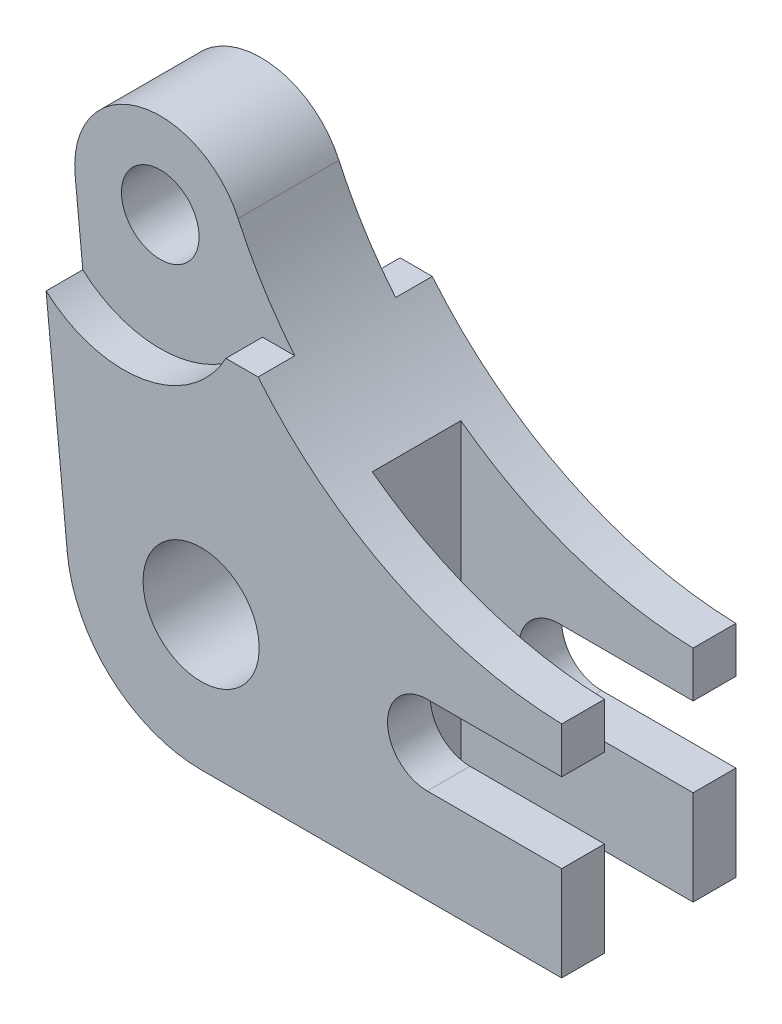
ISO-10303-21;
HEADER;
FILE_DESCRIPTION(('STEP AP214'),'2;1');
FILE_NAME('part.step','',(''),(''),'','','');
FILE_SCHEMA(('AUTOMOTIVE_DESIGN { 1 0 10303 214 1 1 1 1 }'));
ENDSEC;
DATA;
#1=APPLICATION_CONTEXT('core data for automotive mechanical design processes');
#2=APPLICATION_PROTOCOL_DEFINITION('international standard','automotive_design',2000,#1);
#3=PRODUCT_CONTEXT('',#1,'mechanical');
#4=PRODUCT('Part','Part','',(#3));
#5=PRODUCT_RELATED_PRODUCT_CATEGORY('part','',(#4));
#6=PRODUCT_DEFINITION_FORMATION('','',#4);
#7=PRODUCT_DEFINITION_CONTEXT('part definition',#1,'design');
#8=PRODUCT_DEFINITION('design','',#6,#7);
#9=PRODUCT_DEFINITION_SHAPE('','',#8);
#10=(LENGTH_UNIT() NAMED_UNIT(*) SI_UNIT(.MILLI.,.METRE.));
#11=(NAMED_UNIT(*) PLANE_ANGLE_UNIT() SI_UNIT($,.RADIAN.));
#12=(NAMED_UNIT(*) SI_UNIT($,.STERADIAN.) SOLID_ANGLE_UNIT());
#13=UNCERTAINTY_MEASURE_WITH_UNIT(LENGTH_MEASURE(1.E-05),#10,'distance_accuracy_value','');
#14=(GEOMETRIC_REPRESENTATION_CONTEXT(3) GLOBAL_UNCERTAINTY_ASSIGNED_CONTEXT((#13)) GLOBAL_UNIT_ASSIGNED_CONTEXT((#10,
#11,#12)) REPRESENTATION_CONTEXT('',''));
#15=CARTESIAN_POINT('',(0.,0.,0.));
#16=DIRECTION('',(0.,0.,1.));
#17=DIRECTION('',(1.,0.,0.));
#18=AXIS2_PLACEMENT_3D('',#15,#16,#17);
#19=CARTESIAN_POINT('',(61.0021233470939,80.9700791555678,14.25));
#20=DIRECTION('',(0.,0.,-1.));
#21=DIRECTION('',(-1.,0.,0.));
#22=AXIS2_PLACEMENT_3D('',#19,#20,#21);
#23=CYLINDRICAL_SURFACE('',#22,67.);
#24=CARTESIAN_POINT('',(61.0021233470939,80.9700791555678,7.25000000000001));
#25=DIRECTION('',(0.,0.,-1.));
#26=DIRECTION('',(-1.,0.,0.));
#27=AXIS2_PLACEMENT_3D('',#24,#25,#26);
#28=CIRCLE('',#27,67.);
#29=CARTESIAN_POINT('',(21.,27.2222408016034,7.25000000000001));
#30=VERTEX_POINT('',#29);
#31=CARTESIAN_POINT('',(59.,14.,7.25000000000001));
#32=VERTEX_POINT('',#31);
#33=EDGE_CURVE('E477',#30,#32,#28,.F.);
#34=ORIENTED_EDGE('',*,*,#33,.F.);
#35=DIRECTION('',(0.,0.,-1.));
#36=VECTOR('',#35,1.);
#37=CARTESIAN_POINT('',(21.,27.2222408016034,76.433832219726));
#38=LINE('',#37,#36);
#39=CARTESIAN_POINT('',(21.,27.2222408016034,-7.25000000000001));
#40=VERTEX_POINT('',#39);
#41=EDGE_CURVE('E220',#30,#40,#38,.T.);
#42=ORIENTED_EDGE('',*,*,#41,.T.);
#43=CARTESIAN_POINT('',(61.0021233470939,80.9700791555678,-7.25000000000001));
#44=DIRECTION('',(0.,0.,-1.));
#45=DIRECTION('',(-1.,0.,0.));
#46=AXIS2_PLACEMENT_3D('',#43,#44,#45);
#47=CIRCLE('',#46,67.);
#48=CARTESIAN_POINT('',(59.,14.,-7.25000000000001));
#49=VERTEX_POINT('',#48);
#50=EDGE_CURVE('E206',#49,#40,#47,.T.);
#51=ORIENTED_EDGE('',*,*,#50,.F.);
#52=DIRECTION('',(0.,0.,-1.));
#53=VECTOR('',#52,1.);
#54=CARTESIAN_POINT('',(59.,14.,14.25));
#55=LINE('',#54,#53);
#56=CARTESIAN_POINT('',(59.,14.,-14.25));
#57=VERTEX_POINT('',#56);
#58=EDGE_CURVE('E218',#49,#57,#55,.T.);
#59=ORIENTED_EDGE('',*,*,#58,.T.);
#60=CARTESIAN_POINT('',(61.0021233470939,80.9700791555678,-14.25));
#61=DIRECTION('',(0.,0.,-1.));
#62=DIRECTION('',(-1.,0.,0.));
#63=AXIS2_PLACEMENT_3D('',#60,#61,#62);
#64=CIRCLE('',#63,67.);
#65=CARTESIAN_POINT('',(9.32180970290396,38.3303654881643,-14.25));
#66=VERTEX_POINT('',#65);
#67=EDGE_CURVE('E281',#57,#66,#64,.T.);
#68=ORIENTED_EDGE('',*,*,#67,.T.);
#69=DIRECTION('',(0.,0.,-1.));
#70=VECTOR('',#69,1.);
#71=CARTESIAN_POINT('',(9.32180970290396,38.3303654881643,-8.25));
#72=LINE('',#71,#70);
#73=CARTESIAN_POINT('',(9.32180970290396,38.3303654881643,-8.25));
#74=VERTEX_POINT('',#73);
#75=EDGE_CURVE('E340',#74,#66,#72,.T.);
#76=ORIENTED_EDGE('',*,*,#75,.F.);
#77=CARTESIAN_POINT('',(61.0021233470939,80.9700791555678,-8.25));
#78=DIRECTION('',(0.,0.,-1.));
#79=DIRECTION('',(1.,0.,0.));
#80=AXIS2_PLACEMENT_3D('',#77,#78,#79);
#81=CIRCLE('',#80,67.);
#82=CARTESIAN_POINT('',(0.0534173060214305,53.1446369862341,-8.25));
#83=VERTEX_POINT('',#82);
#84=EDGE_CURVE('E320',#74,#83,#81,.T.);
#85=ORIENTED_EDGE('',*,*,#84,.T.);
#86=DIRECTION('',(0.,0.,-1.));
#87=VECTOR('',#86,1.);
#88=CARTESIAN_POINT('',(0.053417306021427,53.1446369862341,14.25));
#89=LINE('',#88,#87);
#90=CARTESIAN_POINT('',(0.0534173060214305,53.1446369862341,8.25));
#91=VERTEX_POINT('',#90);
#92=EDGE_CURVE('E227',#91,#83,#89,.T.);
#93=ORIENTED_EDGE('',*,*,#92,.F.);
#94=CARTESIAN_POINT('',(61.0021233470939,80.9700791555678,8.25));
#95=DIRECTION('',(0.,0.,-1.));
#96=DIRECTION('',(1.,0.,0.));
#97=AXIS2_PLACEMENT_3D('',#94,#95,#96);
#98=CIRCLE('',#97,67.);
#99=CARTESIAN_POINT('',(9.32180970290396,38.3303654881643,8.25));
#100=VERTEX_POINT('',#99);
#101=EDGE_CURVE('E353',#100,#91,#98,.T.);
#102=ORIENTED_EDGE('',*,*,#101,.F.);
#103=DIRECTION('',(0.,0.,1.));
#104=VECTOR('',#103,1.);
#105=CARTESIAN_POINT('',(9.32180970290396,38.3303654881643,8.25));
#106=LINE('',#105,#104);
#107=CARTESIAN_POINT('',(9.32180970290396,38.3303654881643,14.25));
#108=VERTEX_POINT('',#107);
#109=EDGE_CURVE('E363',#100,#108,#106,.T.);
#110=ORIENTED_EDGE('',*,*,#109,.T.);
#111=CARTESIAN_POINT('',(61.0021233470939,80.9700791555678,14.25));
#112=DIRECTION('',(0.,0.,-1.));
#113=DIRECTION('',(-1.,0.,0.));
#114=AXIS2_PLACEMENT_3D('',#111,#112,#113);
#115=CIRCLE('',#114,67.);
#116=CARTESIAN_POINT('',(59.,14.,14.25));
#117=VERTEX_POINT('',#116);
#118=EDGE_CURVE('E383',#117,#108,#115,.T.);
#119=ORIENTED_EDGE('',*,*,#118,.F.);
#120=EDGE_CURVE('E226',#117,#32,#55,.T.);
#121=ORIENTED_EDGE('',*,*,#120,.T.);
#122=EDGE_LOOP('',(#34,#42,#51,#59,#68,#76,#85,#93,#102,#110,#119,#121));
#123=FACE_BOUND('',#122,.T.);
#124=ADVANCED_FACE('F43',(#123),#23,.F.);
#125=CARTESIAN_POINT('',(59.,-22.,14.25));
#126=DIRECTION('',(-1.,0.,0.));
#127=DIRECTION('',(0.,0.,1.));
#128=AXIS2_PLACEMENT_3D('',#125,#126,#127);
#129=PLANE('',#128);
#130=DIRECTION('',(0.,-1.,0.));
#131=VECTOR('',#130,1.);
#132=CARTESIAN_POINT('',(59.,-22.,7.25000000000001));
#133=LINE('',#132,#131);
#134=CARTESIAN_POINT('',(59.,-6.5,7.25000000000001));
#135=VERTEX_POINT('',#134);
#136=CARTESIAN_POINT('',(59.,-22.,7.25000000000001));
#137=VERTEX_POINT('',#136);
#138=EDGE_CURVE('E486',#135,#137,#133,.T.);
#139=ORIENTED_EDGE('',*,*,#138,.F.);
#140=DIRECTION('',(0.,0.,-1.));
#141=VECTOR('',#140,1.);
#142=CARTESIAN_POINT('',(59.,-6.5,14.25));
#143=LINE('',#142,#141);
#144=CARTESIAN_POINT('',(59.,-6.5,14.25));
#145=VERTEX_POINT('',#144);
#146=EDGE_CURVE('E12',#145,#135,#143,.T.);
#147=ORIENTED_EDGE('',*,*,#146,.F.);
#148=DIRECTION('',(0.,1.,0.));
#149=VECTOR('',#148,1.);
#150=CARTESIAN_POINT('',(59.,-22.,14.25));
#151=LINE('',#150,#149);
#152=CARTESIAN_POINT('',(59.,-22.,14.25));
#153=VERTEX_POINT('',#152);
#154=EDGE_CURVE('E290',#153,#145,#151,.T.);
#155=ORIENTED_EDGE('',*,*,#154,.F.);
#156=DIRECTION('',(0.,0.,-1.));
#157=VECTOR('',#156,1.);
#158=CARTESIAN_POINT('',(59.,-22.,14.25));
#159=LINE('',#158,#157);
#160=EDGE_CURVE('E291',#153,#137,#159,.T.);
#161=ORIENTED_EDGE('',*,*,#160,.T.);
#162=EDGE_LOOP('',(#139,#147,#155,#161));
#163=FACE_BOUND('',#162,.T.);
#164=ADVANCED_FACE('F430',(#163),#129,.F.);
#165=CARTESIAN_POINT('',(59.,-6.5,14.25));
#166=DIRECTION('',(0.,-1.,0.));
#167=DIRECTION('',(1.,0.,0.));
#168=AXIS2_PLACEMENT_3D('',#165,#166,#167);
#169=PLANE('',#168);
#170=DIRECTION('',(1.,0.,0.));
#171=VECTOR('',#170,1.);
#172=CARTESIAN_POINT('',(59.,-6.5,7.25));
#173=LINE('',#172,#171);
#174=CARTESIAN_POINT('',(37.,-6.5,7.25));
#175=VERTEX_POINT('',#174);
#176=EDGE_CURVE('E333',#175,#135,#173,.T.);
#177=ORIENTED_EDGE('',*,*,#176,.F.);
#178=DIRECTION('',(0.,0.,-1.));
#179=VECTOR('',#178,1.);
#180=CARTESIAN_POINT('',(37.,-6.5,14.25));
#181=LINE('',#180,#179);
#182=CARTESIAN_POINT('',(37.,-6.5,14.25));
#183=VERTEX_POINT('',#182);
#184=EDGE_CURVE('E244',#183,#175,#181,.T.);
#185=ORIENTED_EDGE('',*,*,#184,.F.);
#186=DIRECTION('',(-1.,0.,0.));
#187=VECTOR('',#186,1.);
#188=CARTESIAN_POINT('',(59.,-6.5,14.25));
#189=LINE('',#188,#187);
#190=EDGE_CURVE('E375',#145,#183,#189,.T.);
#191=ORIENTED_EDGE('',*,*,#190,.F.);
#192=ORIENTED_EDGE('',*,*,#146,.T.);
#193=EDGE_LOOP('',(#177,#185,#191,#192));
#194=FACE_BOUND('',#193,.T.);
#195=ADVANCED_FACE('F435',(#194),#169,.F.);
#196=CARTESIAN_POINT('',(37.,0.,14.25));
#197=DIRECTION('',(0.,0.,-1.));
#198=DIRECTION('',(-1.,0.,0.));
#199=AXIS2_PLACEMENT_3D('',#196,#197,#198);
#200=CYLINDRICAL_SURFACE('',#199,6.5);
#201=CARTESIAN_POINT('',(37.,0.,7.25));
#202=DIRECTION('',(0.,0.,-1.));
#203=DIRECTION('',(-1.,0.,0.));
#204=AXIS2_PLACEMENT_3D('',#201,#202,#203);
#205=CIRCLE('',#204,6.5);
#206=CARTESIAN_POINT('',(37.,6.5,7.25));
#207=VERTEX_POINT('',#206);
#208=EDGE_CURVE('E463',#207,#175,#205,.F.);
#209=ORIENTED_EDGE('',*,*,#208,.F.);
#210=DIRECTION('',(0.,0.,-1.));
#211=VECTOR('',#210,1.);
#212=CARTESIAN_POINT('',(37.,6.5,14.25));
#213=LINE('',#212,#211);
#214=CARTESIAN_POINT('',(37.,6.5,14.25));
#215=VERTEX_POINT('',#214);
#216=EDGE_CURVE('E240',#215,#207,#213,.T.);
#217=ORIENTED_EDGE('',*,*,#216,.F.);
#218=CARTESIAN_POINT('',(37.,0.,14.25));
#219=DIRECTION('',(0.,0.,-1.));
#220=DIRECTION('',(-1.,0.,0.));
#221=AXIS2_PLACEMENT_3D('',#218,#219,#220);
#222=CIRCLE('',#221,6.5);
#223=EDGE_CURVE('E377',#183,#215,#222,.T.);
#224=ORIENTED_EDGE('',*,*,#223,.F.);
#225=ORIENTED_EDGE('',*,*,#184,.T.);
#226=EDGE_LOOP('',(#209,#217,#224,#225));
#227=FACE_BOUND('',#226,.T.);
#228=ADVANCED_FACE('F449',(#227),#200,.F.);
#229=CARTESIAN_POINT('',(37.,6.5,14.25));
#230=DIRECTION('',(0.,1.,0.));
#231=DIRECTION('',(0.,0.,1.));
#232=AXIS2_PLACEMENT_3D('',#229,#230,#231);
#233=PLANE('',#232);
#234=DIRECTION('',(-1.,0.,0.));
#235=VECTOR('',#234,1.);
#236=CARTESIAN_POINT('',(37.,6.5,7.25));
#237=LINE('',#236,#235);
#238=CARTESIAN_POINT('',(59.,6.5,7.25000000000001));
#239=VERTEX_POINT('',#238);
#240=EDGE_CURVE('E465',#239,#207,#237,.T.);
#241=ORIENTED_EDGE('',*,*,#240,.F.);
#242=DIRECTION('',(0.,0.,-1.));
#243=VECTOR('',#242,1.);
#244=CARTESIAN_POINT('',(59.,6.5,14.25));
#245=LINE('',#244,#243);
#246=CARTESIAN_POINT('',(59.,6.5,14.25));
#247=VERTEX_POINT('',#246);
#248=EDGE_CURVE('E236',#247,#239,#245,.T.);
#249=ORIENTED_EDGE('',*,*,#248,.F.);
#250=DIRECTION('',(1.,0.,0.));
#251=VECTOR('',#250,1.);
#252=CARTESIAN_POINT('',(37.,6.5,14.25));
#253=LINE('',#252,#251);
#254=EDGE_CURVE('E379',#215,#247,#253,.T.);
#255=ORIENTED_EDGE('',*,*,#254,.F.);
#256=ORIENTED_EDGE('',*,*,#216,.T.);
#257=EDGE_LOOP('',(#241,#249,#255,#256));
#258=FACE_BOUND('',#257,.T.);
#259=ADVANCED_FACE('F447',(#258),#233,.F.);
#260=CARTESIAN_POINT('',(59.,6.5,14.25));
#261=DIRECTION('',(-1.,0.,0.));
#262=DIRECTION('',(0.,0.,1.));
#263=AXIS2_PLACEMENT_3D('',#260,#261,#262);
#264=PLANE('',#263);
#265=EDGE_CURVE('E484',#32,#239,#133,.T.);
#266=ORIENTED_EDGE('',*,*,#265,.F.);
#267=ORIENTED_EDGE('',*,*,#120,.F.);
#268=DIRECTION('',(0.,1.,0.));
#269=VECTOR('',#268,1.);
#270=CARTESIAN_POINT('',(59.,6.5,14.25));
#271=LINE('',#270,#269);
#272=EDGE_CURVE('E381',#247,#117,#271,.T.);
#273=ORIENTED_EDGE('',*,*,#272,.F.);
#274=ORIENTED_EDGE('',*,*,#248,.T.);
#275=EDGE_LOOP('',(#266,#267,#273,#274));
#276=FACE_BOUND('',#275,.T.);
#277=ADVANCED_FACE('F443',(#276),#264,.F.);
#278=CARTESIAN_POINT('',(0.,-22.,14.25));
#279=DIRECTION('',(0.,1.,0.));
#280=DIRECTION('',(0.,0.,1.));
#281=AXIS2_PLACEMENT_3D('',#278,#279,#280);
#282=PLANE('',#281);
#283=DIRECTION('',(-1.,0.,0.));
#284=VECTOR('',#283,1.);
#285=CARTESIAN_POINT('',(21.,-22.,7.25000000000001));
#286=LINE('',#285,#284);
#287=CARTESIAN_POINT('',(21.,-22.,7.25000000000001));
#288=VERTEX_POINT('',#287);
#289=EDGE_CURVE('E473',#137,#288,#286,.T.);
#290=ORIENTED_EDGE('',*,*,#289,.F.);
#291=ORIENTED_EDGE('',*,*,#160,.F.);
#292=DIRECTION('',(1.,0.,0.));
#293=VECTOR('',#292,1.);
#294=CARTESIAN_POINT('',(0.,-22.,14.25));
#295=LINE('',#294,#293);
#296=CARTESIAN_POINT('',(0.,-22.,14.25));
#297=VERTEX_POINT('',#296);
#298=EDGE_CURVE('E390',#297,#153,#295,.T.);
#299=ORIENTED_EDGE('',*,*,#298,.F.);
#300=DIRECTION('',(0.,0.,-1.));
#301=VECTOR('',#300,1.);
#302=CARTESIAN_POINT('',(0.,-22.,14.25));
#303=LINE('',#302,#301);
#304=CARTESIAN_POINT('',(0.,-22.,-14.25));
#305=VERTEX_POINT('',#304);
#306=EDGE_CURVE('E294',#297,#305,#303,.T.);
#307=ORIENTED_EDGE('',*,*,#306,.T.);
#308=DIRECTION('',(1.,0.,0.));
#309=VECTOR('',#308,1.);
#310=CARTESIAN_POINT('',(0.,-22.,-14.25));
#311=LINE('',#310,#309);
#312=CARTESIAN_POINT('',(59.,-22.,-14.25));
#313=VERTEX_POINT('',#312);
#314=EDGE_CURVE('E287',#305,#313,#311,.T.);
#315=ORIENTED_EDGE('',*,*,#314,.T.);
#316=CARTESIAN_POINT('',(59.,-22.,-7.25000000000001));
#317=VERTEX_POINT('',#316);
#318=EDGE_CURVE('E295',#317,#313,#159,.T.);
#319=ORIENTED_EDGE('',*,*,#318,.F.);
#320=DIRECTION('',(1.,0.,0.));
#321=VECTOR('',#320,1.);
#322=CARTESIAN_POINT('',(21.,-22.,-7.25000000000001));
#323=LINE('',#322,#321);
#324=CARTESIAN_POINT('',(21.,-22.,-7.25));
#325=VERTEX_POINT('',#324);
#326=EDGE_CURVE('E481',#325,#317,#323,.T.);
#327=ORIENTED_EDGE('',*,*,#326,.F.);
#328=DIRECTION('',(0.,0.,-1.));
#329=VECTOR('',#328,1.);
#330=CARTESIAN_POINT('',(21.,-22.,76.433832219726));
#331=LINE('',#330,#329);
#332=EDGE_CURVE('E479',#288,#325,#331,.T.);
#333=ORIENTED_EDGE('',*,*,#332,.F.);
#334=EDGE_LOOP('',(#290,#291,#299,#307,#315,#319,#327,#333));
#335=FACE_BOUND('',#334,.T.);
#336=ADVANCED_FACE('F398',(#335),#282,.F.);
#337=CARTESIAN_POINT('',(-12.6821332100236,47.3303654881643,14.25));
#338=DIRECTION('',(0.,0.,-1.));
#339=DIRECTION('',(-1.,0.,0.));
#340=AXIS2_PLACEMENT_3D('',#337,#338,#339);
#341=CYLINDRICAL_SURFACE('',#340,14.);
#342=CARTESIAN_POINT('',(-12.6821332100236,47.3303654881643,-8.25));
#343=DIRECTION('',(0.,0.,1.));
#344=DIRECTION('',(1.,0.,0.));
#345=AXIS2_PLACEMENT_3D('',#342,#343,#344);
#346=CIRCLE('',#345,14.);
#347=CARTESIAN_POINT('',(-26.6152327900073,45.9633482628683,-8.25));
#348=VERTEX_POINT('',#347);
#349=EDGE_CURVE('E317',#83,#348,#346,.T.);
#350=ORIENTED_EDGE('',*,*,#349,.T.);
#351=DIRECTION('',(0.,0.,-1.));
#352=VECTOR('',#351,1.);
#353=CARTESIAN_POINT('',(-26.6152327900073,45.9633482628683,14.25));
#354=LINE('',#353,#352);
#355=CARTESIAN_POINT('',(-26.6152327900073,45.9633482628683,8.25));
#356=VERTEX_POINT('',#355);
#357=EDGE_CURVE('E232',#356,#348,#354,.T.);
#358=ORIENTED_EDGE('',*,*,#357,.F.);
#359=CARTESIAN_POINT('',(-12.6821332100236,47.3303654881643,8.25));
#360=DIRECTION('',(0.,0.,1.));
#361=DIRECTION('',(1.,0.,0.));
#362=AXIS2_PLACEMENT_3D('',#359,#360,#361);
#363=CIRCLE('',#362,14.);
#364=EDGE_CURVE('E315',#91,#356,#363,.T.);
#365=ORIENTED_EDGE('',*,*,#364,.F.);
#366=ORIENTED_EDGE('',*,*,#92,.T.);
#367=EDGE_LOOP('',(#350,#358,#365,#366));
#368=FACE_BOUND('',#367,.T.);
#369=ADVANCED_FACE('F314',(#368),#341,.T.);
#370=CARTESIAN_POINT('',(-12.6821332100236,47.3303654881643,14.25));
#371=DIRECTION('',(0.,0.,-1.));
#372=DIRECTION('',(-1.,0.,0.));
#373=AXIS2_PLACEMENT_3D('',#370,#371,#372);
#374=CYLINDRICAL_SURFACE('',#373,6.35);
#375=CARTESIAN_POINT('',(-12.6821332100236,47.3303654881643,8.25));
#376=DIRECTION('',(0.,0.,1.));
#377=DIRECTION('',(1.,0.,0.));
#378=AXIS2_PLACEMENT_3D('',#375,#376,#377);
#379=CIRCLE('',#378,6.35);
#380=CARTESIAN_POINT('',(-19.0321332100236,47.3303654881643,8.25));
#381=VERTEX_POINT('',#380);
#382=EDGE_CURVE('E47',#381,#381,#379,.T.);
#383=CARTESIAN_POINT('',(-12.6821332100236,47.3303654881643,-8.25));
#384=DIRECTION('',(0.,0.,-1.));
#385=DIRECTION('',(-1.,0.,0.));
#386=AXIS2_PLACEMENT_3D('',#383,#384,#385);
#387=CIRCLE('',#386,6.35);
#388=CARTESIAN_POINT('',(-19.0321332100236,47.3303654881643,-8.24999999999999));
#389=VERTEX_POINT('',#388);
#390=EDGE_CURVE('E339',#389,#389,#387,.T.);
#391=CARTESIAN_POINT('',(-19.0321332100236,47.3303654881643,8.25));
#392=CARTESIAN_POINT('',(-19.0321332100236,47.3303654881643,8.078125));
#393=CARTESIAN_POINT('',(-19.0321332100236,47.3303654881643,7.90625));
#394=CARTESIAN_POINT('',(-19.0321332100236,47.3303654881643,7.5625));
#395=CARTESIAN_POINT('',(-19.0321332100236,47.3303654881643,7.390625));
#396=CARTESIAN_POINT('',(-19.0321332100236,47.3303654881643,7.046875));
#397=CARTESIAN_POINT('',(-19.0321332100236,47.3303654881643,6.875));
#398=CARTESIAN_POINT('',(-19.0321332100236,47.3303654881643,6.53125));
#399=CARTESIAN_POINT('',(-19.0321332100236,47.3303654881643,6.359375));
#400=CARTESIAN_POINT('',(-19.0321332100236,47.3303654881643,6.015625));
#401=CARTESIAN_POINT('',(-19.0321332100236,47.3303654881643,5.84375));
#402=CARTESIAN_POINT('',(-19.0321332100236,47.3303654881643,5.5));
#403=CARTESIAN_POINT('',(-19.0321332100236,47.3303654881643,5.328125));
#404=CARTESIAN_POINT('',(-19.0321332100236,47.3303654881643,4.984375));
#405=CARTESIAN_POINT('',(-19.0321332100236,47.3303654881643,4.8125));
#406=CARTESIAN_POINT('',(-19.0321332100236,47.3303654881643,4.46875));
#407=CARTESIAN_POINT('',(-19.0321332100236,47.3303654881643,4.296875));
#408=CARTESIAN_POINT('',(-19.0321332100236,47.3303654881643,3.953125));
#409=CARTESIAN_POINT('',(-19.0321332100236,47.3303654881643,3.78125));
#410=CARTESIAN_POINT('',(-19.0321332100236,47.3303654881643,3.4375));
#411=CARTESIAN_POINT('',(-19.0321332100236,47.3303654881643,3.265625));
#412=CARTESIAN_POINT('',(-19.0321332100236,47.3303654881643,2.921875));
#413=CARTESIAN_POINT('',(-19.0321332100236,47.3303654881643,2.75));
#414=CARTESIAN_POINT('',(-19.0321332100236,47.3303654881643,2.40625));
#415=CARTESIAN_POINT('',(-19.0321332100236,47.3303654881643,2.234375));
#416=CARTESIAN_POINT('',(-19.0321332100236,47.3303654881643,1.890625));
#417=CARTESIAN_POINT('',(-19.0321332100236,47.3303654881643,1.71875));
#418=CARTESIAN_POINT('',(-19.0321332100236,47.3303654881643,1.375));
#419=CARTESIAN_POINT('',(-19.0321332100236,47.3303654881643,1.203125));
#420=CARTESIAN_POINT('',(-19.0321332100236,47.3303654881643,0.859375000000001));
#421=CARTESIAN_POINT('',(-19.0321332100236,47.3303654881643,0.687500000000002));
#422=CARTESIAN_POINT('',(-19.0321332100236,47.3303654881643,0.343750000000002));
#423=CARTESIAN_POINT('',(-19.0321332100236,47.3303654881643,0.171875000000002));
#424=CARTESIAN_POINT('',(-19.0321332100236,47.3303654881643,-0.171874999999998));
#425=CARTESIAN_POINT('',(-19.0321332100236,47.3303654881643,-0.343749999999999));
#426=CARTESIAN_POINT('',(-19.0321332100236,47.3303654881643,-0.687499999999998));
#427=CARTESIAN_POINT('',(-19.0321332100236,47.3303654881643,-0.859374999999998));
#428=CARTESIAN_POINT('',(-19.0321332100236,47.3303654881643,-1.203125));
#429=CARTESIAN_POINT('',(-19.0321332100236,47.3303654881643,-1.375));
#430=CARTESIAN_POINT('',(-19.0321332100236,47.3303654881643,-1.71875));
#431=CARTESIAN_POINT('',(-19.0321332100236,47.3303654881643,-1.890625));
#432=CARTESIAN_POINT('',(-19.0321332100236,47.3303654881643,-2.234375));
#433=CARTESIAN_POINT('',(-19.0321332100236,47.3303654881643,-2.40625));
#434=CARTESIAN_POINT('',(-19.0321332100236,47.3303654881643,-2.75));
#435=CARTESIAN_POINT('',(-19.0321332100236,47.3303654881643,-2.92187499999999));
#436=CARTESIAN_POINT('',(-19.0321332100236,47.3303654881643,-3.26562499999999));
#437=CARTESIAN_POINT('',(-19.0321332100236,47.3303654881643,-3.4375));
#438=CARTESIAN_POINT('',(-19.0321332100236,47.3303654881643,-3.78125));
#439=CARTESIAN_POINT('',(-19.0321332100236,47.3303654881643,-3.953125));
#440=CARTESIAN_POINT('',(-19.0321332100236,47.3303654881643,-4.296875));
#441=CARTESIAN_POINT('',(-19.0321332100236,47.3303654881643,-4.46875));
#442=CARTESIAN_POINT('',(-19.0321332100236,47.3303654881643,-4.8125));
#443=CARTESIAN_POINT('',(-19.0321332100236,47.3303654881643,-4.984375));
#444=CARTESIAN_POINT('',(-19.0321332100236,47.3303654881643,-5.328125));
#445=CARTESIAN_POINT('',(-19.0321332100236,47.3303654881643,-5.5));
#446=CARTESIAN_POINT('',(-19.0321332100236,47.3303654881643,-5.84374999999999));
#447=CARTESIAN_POINT('',(-19.0321332100236,47.3303654881643,-6.01562499999999));
#448=CARTESIAN_POINT('',(-19.0321332100236,47.3303654881643,-6.35937499999999));
#449=CARTESIAN_POINT('',(-19.0321332100236,47.3303654881643,-6.53124999999999));
#450=CARTESIAN_POINT('',(-19.0321332100236,47.3303654881643,-6.875));
#451=CARTESIAN_POINT('',(-19.0321332100236,47.3303654881643,-7.046875));
#452=CARTESIAN_POINT('',(-19.0321332100236,47.3303654881643,-7.390625));
#453=CARTESIAN_POINT('',(-19.0321332100236,47.3303654881643,-7.5625));
#454=CARTESIAN_POINT('',(-19.0321332100236,47.3303654881643,-7.90625));
#455=CARTESIAN_POINT('',(-19.0321332100236,47.3303654881643,-8.07812499999999));
#456=CARTESIAN_POINT('',(-19.0321332100236,47.3303654881643,-8.24999999999999));
#457=B_SPLINE_CURVE_WITH_KNOTS('',3,(#391,#392,#393,#394,#395,#396,#397,#398,#399,#400,#401,
#402,#403,#404,#405,#406,#407,#408,#409,#410,#411,#412,#413,#414,#415,#416,#417,#418,#419,#420,
#421,#422,#423,#424,#425,#426,#427,#428,#429,#430,#431,#432,#433,#434,#435,#436,#437,#438,#439,
#440,#441,#442,#443,#444,#445,#446,#447,#448,#449,#450,#451,#452,#453,#454,#455,#456),
.UNSPECIFIED.,.F.,.F.,(4,2,2,2,2,2,2,2,2,2,2,2,2,2,2,2,2,2,2,2,2,2,2,2,2,2,2,2,2,2,2,2,4),(0.,
0.515625,1.03125,1.546875,2.0625,2.578125,3.09375,3.609375,4.125,4.640625,5.15625,5.671875,
6.1875,6.703125,7.21875,7.734375,8.25,8.765625,9.28125,9.796875,10.3125,10.828125,11.34375,
11.859375,12.375,12.890625,13.40625,13.921875,14.4375,14.953125,15.46875,15.984375,16.5),.UNSPECIFIED.);
#458=EDGE_CURVE('BSEAM524',#381,#389,#457,.T.);
#459=ORIENTED_EDGE('',*,*,#382,.T.);
#460=ORIENTED_EDGE('',*,*,#390,.T.);
#461=ORIENTED_EDGE('',*,*,#458,.T.);
#462=ORIENTED_EDGE('',*,*,#458,.F.);
#463=EDGE_LOOP('',(#459,#461,#460,#462));
#464=FACE_BOUND('',#463,.T.);
#465=ADVANCED_FACE('F524',(#464),#374,.F.);
#466=CARTESIAN_POINT('',(37.,0.,-14.25));
#467=DIRECTION('',(0.,0.,-1.));
#468=DIRECTION('',(-1.,0.,0.));
#469=AXIS2_PLACEMENT_3D('',#466,#467,#468);
#470=PLANE('',#469);
#471=CARTESIAN_POINT('',(0.,0.,-14.25));
#472=DIRECTION('',(0.,0.,1.));
#473=DIRECTION('',(1.,0.,0.));
#474=AXIS2_PLACEMENT_3D('',#471,#472,#473);
#475=CIRCLE('',#474,9.5);
#476=CARTESIAN_POINT('',(-9.5,0.,-14.25));
#477=VERTEX_POINT('',#476);
#478=EDGE_CURVE('E370',#477,#477,#475,.T.);
#479=ORIENTED_EDGE('',*,*,#478,.T.);
#480=EDGE_LOOP('',(#479));
#481=FACE_BOUND('',#480,.T.);
#482=DIRECTION('',(0.0976440875211451,-0.995221398570269,0.));
#483=VECTOR('',#482,1.);
#484=CARTESIAN_POINT('',(-26.6152327900073,45.9633482628683,-14.25));
#485=LINE('',#484,#483);
#486=CARTESIAN_POINT('',(-25.3609717758667,33.1794979309688,-14.25));
#487=VERTEX_POINT('',#486);
#488=CARTESIAN_POINT('',(-21.8948707685459,-2.14816992546519,-14.25));
#489=VERTEX_POINT('',#488);
#490=EDGE_CURVE('E283',#487,#489,#485,.T.);
#491=ORIENTED_EDGE('',*,*,#490,.F.);
#492=CARTESIAN_POINT('',(-12.6821332100236,47.3303654881643,-14.25));
#493=DIRECTION('',(0.,0.,1.));
#494=DIRECTION('',(1.,0.,0.));
#495=AXIS2_PLACEMENT_3D('',#492,#493,#494);
#496=CIRCLE('',#495,19.);
#497=CARTESIAN_POINT('',(4.05106732065795,38.3303654881643,-14.25));
#498=VERTEX_POINT('',#497);
#499=EDGE_CURVE('E329',#487,#498,#496,.T.);
#500=ORIENTED_EDGE('',*,*,#499,.T.);
#501=DIRECTION('',(1.,0.,0.));
#502=VECTOR('',#501,1.);
#503=CARTESIAN_POINT('',(4.05106732065795,38.3303654881643,-14.25));
#504=LINE('',#503,#502);
#505=EDGE_CURVE('E332',#498,#66,#504,.T.);
#506=ORIENTED_EDGE('',*,*,#505,.T.);
#507=ORIENTED_EDGE('',*,*,#67,.F.);
#508=DIRECTION('',(0.,1.,0.));
#509=VECTOR('',#508,1.);
#510=CARTESIAN_POINT('',(59.,6.5,-14.25));
#511=LINE('',#510,#509);
#512=CARTESIAN_POINT('',(59.,6.5,-14.25));
#513=VERTEX_POINT('',#512);
#514=EDGE_CURVE('E224',#513,#57,#511,.T.);
#515=ORIENTED_EDGE('',*,*,#514,.F.);
#516=DIRECTION('',(1.,0.,0.));
#517=VECTOR('',#516,1.);
#518=CARTESIAN_POINT('',(37.,6.5,-14.25));
#519=LINE('',#518,#517);
#520=CARTESIAN_POINT('',(37.,6.5,-14.25));
#521=VERTEX_POINT('',#520);
#522=EDGE_CURVE('E275',#521,#513,#519,.T.);
#523=ORIENTED_EDGE('',*,*,#522,.F.);
#524=CARTESIAN_POINT('',(37.,0.,-14.25));
#525=DIRECTION('',(0.,0.,-1.));
#526=DIRECTION('',(-1.,0.,0.));
#527=AXIS2_PLACEMENT_3D('',#524,#525,#526);
#528=CIRCLE('',#527,6.5);
#529=CARTESIAN_POINT('',(37.,-6.5,-14.25));
#530=VERTEX_POINT('',#529);
#531=EDGE_CURVE('E258',#530,#521,#528,.T.);
#532=ORIENTED_EDGE('',*,*,#531,.F.);
#533=DIRECTION('',(-1.,0.,0.));
#534=VECTOR('',#533,1.);
#535=CARTESIAN_POINT('',(59.,-6.5,-14.25));
#536=LINE('',#535,#534);
#537=CARTESIAN_POINT('',(59.,-6.5,-14.25));
#538=VERTEX_POINT('',#537);
#539=EDGE_CURVE('E264',#538,#530,#536,.T.);
#540=ORIENTED_EDGE('',*,*,#539,.F.);
#541=DIRECTION('',(0.,1.,0.));
#542=VECTOR('',#541,1.);
#543=CARTESIAN_POINT('',(59.,-22.,-14.25));
#544=LINE('',#543,#542);
#545=EDGE_CURVE('E270',#313,#538,#544,.T.);
#546=ORIENTED_EDGE('',*,*,#545,.F.);
#547=ORIENTED_EDGE('',*,*,#314,.F.);
#548=CARTESIAN_POINT('',(0.,0.,-14.25));
#549=DIRECTION('',(0.,0.,1.));
#550=DIRECTION('',(1.,0.,0.));
#551=AXIS2_PLACEMENT_3D('',#548,#549,#550);
#552=CIRCLE('',#551,22.);
#553=EDGE_CURVE('E285',#489,#305,#552,.T.);
#554=ORIENTED_EDGE('',*,*,#553,.F.);
#555=EDGE_LOOP('',(#491,#500,#506,#507,#515,#523,#532,#540,#546,#547,#554));
#556=FACE_BOUND('',#555,.T.);
#557=ADVANCED_FACE('F273',(#481,#556),#470,.T.);
#558=CARTESIAN_POINT('',(-26.6152327900073,45.9633482628683,14.25));
#559=DIRECTION('',(0.995221398570269,0.0976440875211451,0.));
#560=DIRECTION('',(-0.0976440875211451,0.995221398570269,0.));
#561=AXIS2_PLACEMENT_3D('',#558,#559,#560);
#562=PLANE('',#561);
#563=DIRECTION('',(0.,0.,-1.));
#564=VECTOR('',#563,1.);
#565=CARTESIAN_POINT('',(-25.3609717758667,33.1794979309688,-8.25));
#566=LINE('',#565,#564);
#567=CARTESIAN_POINT('',(-25.3609717758667,33.1794979309688,-8.25));
#568=VERTEX_POINT('',#567);
#569=EDGE_CURVE('E328',#568,#487,#566,.T.);
#570=ORIENTED_EDGE('',*,*,#569,.T.);
#571=ORIENTED_EDGE('',*,*,#490,.T.);
#572=DIRECTION('',(0.,0.,-1.));
#573=VECTOR('',#572,1.);
#574=CARTESIAN_POINT('',(-21.8948707685459,-2.14816992546519,14.25));
#575=LINE('',#574,#573);
#576=CARTESIAN_POINT('',(-21.8948707685459,-2.14816992546519,14.25));
#577=VERTEX_POINT('',#576);
#578=EDGE_CURVE('E298',#577,#489,#575,.T.);
#579=ORIENTED_EDGE('',*,*,#578,.F.);
#580=DIRECTION('',(0.0976440875211451,-0.995221398570269,0.));
#581=VECTOR('',#580,1.);
#582=CARTESIAN_POINT('',(-26.6152327900073,45.9633482628683,14.25));
#583=LINE('',#582,#581);
#584=CARTESIAN_POINT('',(-25.3609717758667,33.1794979309688,14.25));
#585=VERTEX_POINT('',#584);
#586=EDGE_CURVE('E386',#585,#577,#583,.T.);
#587=ORIENTED_EDGE('',*,*,#586,.F.);
#588=DIRECTION('',(0.,0.,1.));
#589=VECTOR('',#588,1.);
#590=CARTESIAN_POINT('',(-25.3609717758667,33.1794979309688,8.25));
#591=LINE('',#590,#589);
#592=CARTESIAN_POINT('',(-25.3609717758667,33.1794979309688,8.25));
#593=VERTEX_POINT('',#592);
#594=EDGE_CURVE('E361',#593,#585,#591,.T.);
#595=ORIENTED_EDGE('',*,*,#594,.F.);
#596=DIRECTION('',(0.0976440875211452,-0.995221398570269,0.));
#597=VECTOR('',#596,1.);
#598=CARTESIAN_POINT('',(-26.6152327900073,45.9633482628683,8.25));
#599=LINE('',#598,#597);
#600=EDGE_CURVE('E310',#356,#593,#599,.T.);
#601=ORIENTED_EDGE('',*,*,#600,.F.);
#602=ORIENTED_EDGE('',*,*,#357,.T.);
#603=DIRECTION('',(0.0976440875211452,-0.995221398570269,0.));
#604=VECTOR('',#603,1.);
#605=CARTESIAN_POINT('',(-26.6152327900073,45.9633482628683,-8.25));
#606=LINE('',#605,#604);
#607=EDGE_CURVE('E307',#348,#568,#606,.T.);
#608=ORIENTED_EDGE('',*,*,#607,.T.);
#609=EDGE_LOOP('',(#570,#571,#579,#587,#595,#601,#602,#608));
#610=FACE_BOUND('',#609,.T.);
#611=ADVANCED_FACE('F306',(#610),#562,.F.);
#612=CARTESIAN_POINT('',(37.,0.,14.25));
#613=DIRECTION('',(0.,0.,-1.));
#614=DIRECTION('',(-1.,0.,0.));
#615=AXIS2_PLACEMENT_3D('',#612,#613,#614);
#616=PLANE('',#615);
#617=DIRECTION('',(1.,0.,0.));
#618=VECTOR('',#617,1.);
#619=CARTESIAN_POINT('',(4.05106732065795,38.3303654881643,14.25));
#620=LINE('',#619,#618);
#621=CARTESIAN_POINT('',(4.05106732065795,38.3303654881643,14.25));
#622=VERTEX_POINT('',#621);
#623=EDGE_CURVE('E350',#622,#108,#620,.T.);
#624=ORIENTED_EDGE('',*,*,#623,.F.);
#625=CARTESIAN_POINT('',(-12.6821332100236,47.3303654881643,14.25));
#626=DIRECTION('',(0.,0.,1.));
#627=DIRECTION('',(1.,0.,0.));
#628=AXIS2_PLACEMENT_3D('',#625,#626,#627);
#629=CIRCLE('',#628,19.);
#630=EDGE_CURVE('E345',#585,#622,#629,.T.);
#631=ORIENTED_EDGE('',*,*,#630,.F.);
#632=ORIENTED_EDGE('',*,*,#586,.T.);
#633=CARTESIAN_POINT('',(0.,0.,14.25));
#634=DIRECTION('',(0.,0.,1.));
#635=DIRECTION('',(1.,0.,0.));
#636=AXIS2_PLACEMENT_3D('',#633,#634,#635);
#637=CIRCLE('',#636,22.);
#638=EDGE_CURVE('E388',#577,#297,#637,.T.);
#639=ORIENTED_EDGE('',*,*,#638,.T.);
#640=ORIENTED_EDGE('',*,*,#298,.T.);
#641=ORIENTED_EDGE('',*,*,#154,.T.);
#642=ORIENTED_EDGE('',*,*,#190,.T.);
#643=ORIENTED_EDGE('',*,*,#223,.T.);
#644=ORIENTED_EDGE('',*,*,#254,.T.);
#645=ORIENTED_EDGE('',*,*,#272,.T.);
#646=ORIENTED_EDGE('',*,*,#118,.T.);
#647=EDGE_LOOP('',(#624,#631,#632,#639,#640,#641,#642,#643,#644,#645,#646));
#648=FACE_BOUND('',#647,.T.);
#649=CARTESIAN_POINT('',(0.,0.,14.25));
#650=DIRECTION('',(0.,0.,1.));
#651=DIRECTION('',(1.,0.,0.));
#652=AXIS2_PLACEMENT_3D('',#649,#650,#651);
#653=CIRCLE('',#652,9.5);
#654=CARTESIAN_POINT('',(-9.5,0.,14.25));
#655=VERTEX_POINT('',#654);
#656=EDGE_CURVE('E367',#655,#655,#653,.T.);
#657=ORIENTED_EDGE('',*,*,#656,.F.);
#658=EDGE_LOOP('',(#657));
#659=FACE_BOUND('',#658,.T.);
#660=ADVANCED_FACE('F454',(#648,#659),#616,.F.);
#661=CARTESIAN_POINT('',(59.,-6.5,-7.25000000000001));
#662=VERTEX_POINT('',#661);
#663=EDGE_CURVE('E52',#662,#538,#143,.T.);
#664=ORIENTED_EDGE('',*,*,#663,.F.);
#665=DIRECTION('',(0.,1.,0.));
#666=VECTOR('',#665,1.);
#667=CARTESIAN_POINT('',(59.,-22.,-7.25000000000001));
#668=LINE('',#667,#666);
#669=EDGE_CURVE('E213',#317,#662,#668,.T.);
#670=ORIENTED_EDGE('',*,*,#669,.F.);
#671=ORIENTED_EDGE('',*,*,#318,.T.);
#672=ORIENTED_EDGE('',*,*,#545,.T.);
#673=EDGE_LOOP('',(#664,#670,#671,#672));
#674=FACE_BOUND('',#673,.T.);
#675=ADVANCED_FACE('F45',(#674),#129,.F.);
#676=CARTESIAN_POINT('',(37.,-6.5,-7.25));
#677=VERTEX_POINT('',#676);
#678=EDGE_CURVE('E243',#677,#530,#181,.T.);
#679=ORIENTED_EDGE('',*,*,#678,.F.);
#680=DIRECTION('',(1.,0.,0.));
#681=VECTOR('',#680,1.);
#682=CARTESIAN_POINT('',(59.,-6.5,-7.25));
#683=LINE('',#682,#681);
#684=EDGE_CURVE('E469',#677,#662,#683,.T.);
#685=ORIENTED_EDGE('',*,*,#684,.T.);
#686=ORIENTED_EDGE('',*,*,#663,.T.);
#687=ORIENTED_EDGE('',*,*,#539,.T.);
#688=EDGE_LOOP('',(#679,#685,#686,#687));
#689=FACE_BOUND('',#688,.T.);
#690=ADVANCED_FACE('F265',(#689),#169,.F.);
#691=CARTESIAN_POINT('',(37.,6.5,-7.25));
#692=VERTEX_POINT('',#691);
#693=EDGE_CURVE('E239',#692,#521,#213,.T.);
#694=ORIENTED_EDGE('',*,*,#693,.F.);
#695=CARTESIAN_POINT('',(37.,0.,-7.25));
#696=DIRECTION('',(0.,0.,-1.));
#697=DIRECTION('',(-1.,0.,0.));
#698=AXIS2_PLACEMENT_3D('',#695,#696,#697);
#699=CIRCLE('',#698,6.5);
#700=EDGE_CURVE('E260',#692,#677,#699,.F.);
#701=ORIENTED_EDGE('',*,*,#700,.T.);
#702=ORIENTED_EDGE('',*,*,#678,.T.);
#703=ORIENTED_EDGE('',*,*,#531,.T.);
#704=EDGE_LOOP('',(#694,#701,#702,#703));
#705=FACE_BOUND('',#704,.T.);
#706=ADVANCED_FACE('F256',(#705),#200,.F.);
#707=CARTESIAN_POINT('',(59.,6.5,-7.25000000000001));
#708=VERTEX_POINT('',#707);
#709=EDGE_CURVE('E230',#708,#513,#245,.T.);
#710=ORIENTED_EDGE('',*,*,#709,.F.);
#711=DIRECTION('',(-1.,0.,0.));
#712=VECTOR('',#711,1.);
#713=CARTESIAN_POINT('',(37.,6.5,-7.25));
#714=LINE('',#713,#712);
#715=EDGE_CURVE('E209',#708,#692,#714,.T.);
#716=ORIENTED_EDGE('',*,*,#715,.T.);
#717=ORIENTED_EDGE('',*,*,#693,.T.);
#718=ORIENTED_EDGE('',*,*,#522,.T.);
#719=EDGE_LOOP('',(#710,#716,#717,#718));
#720=FACE_BOUND('',#719,.T.);
#721=ADVANCED_FACE('F442',(#720),#233,.F.);
#722=ORIENTED_EDGE('',*,*,#58,.F.);
#723=EDGE_CURVE('E203',#708,#49,#668,.T.);
#724=ORIENTED_EDGE('',*,*,#723,.F.);
#725=ORIENTED_EDGE('',*,*,#709,.T.);
#726=ORIENTED_EDGE('',*,*,#514,.T.);
#727=EDGE_LOOP('',(#722,#724,#725,#726));
#728=FACE_BOUND('',#727,.T.);
#729=ADVANCED_FACE('F222',(#728),#264,.F.);
#730=CARTESIAN_POINT('',(0.,0.,14.25));
#731=DIRECTION('',(0.,0.,-1.));
#732=DIRECTION('',(-1.,0.,0.));
#733=AXIS2_PLACEMENT_3D('',#730,#731,#732);
#734=CYLINDRICAL_SURFACE('',#733,22.);
#735=ORIENTED_EDGE('',*,*,#553,.T.);
#736=ORIENTED_EDGE('',*,*,#306,.F.);
#737=ORIENTED_EDGE('',*,*,#638,.F.);
#738=ORIENTED_EDGE('',*,*,#578,.T.);
#739=EDGE_LOOP('',(#735,#736,#737,#738));
#740=FACE_BOUND('',#739,.T.);
#741=ADVANCED_FACE('F405',(#740),#734,.T.);
#742=CARTESIAN_POINT('',(0.,0.,14.25));
#743=DIRECTION('',(0.,0.,-1.));
#744=DIRECTION('',(-1.,0.,0.));
#745=AXIS2_PLACEMENT_3D('',#742,#743,#744);
#746=CYLINDRICAL_SURFACE('',#745,9.5);
#747=CARTESIAN_POINT('',(-9.5,0.,14.25));
#748=CARTESIAN_POINT('',(-9.5,0.,13.953125));
#749=CARTESIAN_POINT('',(-9.5,0.,13.65625));
#750=CARTESIAN_POINT('',(-9.5,0.,13.0625));
#751=CARTESIAN_POINT('',(-9.5,0.,12.765625));
#752=CARTESIAN_POINT('',(-9.5,0.,12.171875));
#753=CARTESIAN_POINT('',(-9.5,0.,11.875));
#754=CARTESIAN_POINT('',(-9.5,0.,11.28125));
#755=CARTESIAN_POINT('',(-9.5,0.,10.984375));
#756=CARTESIAN_POINT('',(-9.5,0.,10.390625));
#757=CARTESIAN_POINT('',(-9.5,0.,10.09375));
#758=CARTESIAN_POINT('',(-9.5,0.,9.5));
#759=CARTESIAN_POINT('',(-9.5,0.,9.203125));
#760=CARTESIAN_POINT('',(-9.5,0.,8.609375));
#761=CARTESIAN_POINT('',(-9.5,0.,8.3125));
#762=CARTESIAN_POINT('',(-9.5,0.,7.71875));
#763=CARTESIAN_POINT('',(-9.5,0.,7.421875));
#764=CARTESIAN_POINT('',(-9.5,0.,6.828125));
#765=CARTESIAN_POINT('',(-9.5,0.,6.53125));
#766=CARTESIAN_POINT('',(-9.5,0.,5.9375));
#767=CARTESIAN_POINT('',(-9.5,0.,5.640625));
#768=CARTESIAN_POINT('',(-9.5,0.,5.046875));
#769=CARTESIAN_POINT('',(-9.5,0.,4.75));
#770=CARTESIAN_POINT('',(-9.5,0.,4.15625));
#771=CARTESIAN_POINT('',(-9.5,0.,3.859375));
#772=CARTESIAN_POINT('',(-9.5,0.,3.265625));
#773=CARTESIAN_POINT('',(-9.5,0.,2.96875));
#774=CARTESIAN_POINT('',(-9.5,0.,2.375));
#775=CARTESIAN_POINT('',(-9.5,0.,2.078125));
#776=CARTESIAN_POINT('',(-9.5,0.,1.484375));
#777=CARTESIAN_POINT('',(-9.5,0.,1.1875));
#778=CARTESIAN_POINT('',(-9.5,0.,0.593749999999999));
#779=CARTESIAN_POINT('',(-9.5,0.,0.296874999999999));
#780=CARTESIAN_POINT('',(-9.5,0.,-0.296875000000002));
#781=CARTESIAN_POINT('',(-9.5,0.,-0.593750000000002));
#782=CARTESIAN_POINT('',(-9.5,0.,-1.1875));
#783=CARTESIAN_POINT('',(-9.5,0.,-1.484375));
#784=CARTESIAN_POINT('',(-9.5,0.,-2.078125));
#785=CARTESIAN_POINT('',(-9.5,0.,-2.375));
#786=CARTESIAN_POINT('',(-9.5,0.,-2.96875));
#787=CARTESIAN_POINT('',(-9.5,0.,-3.265625));
#788=CARTESIAN_POINT('',(-9.5,0.,-3.859375));
#789=CARTESIAN_POINT('',(-9.5,0.,-4.15625));
#790=CARTESIAN_POINT('',(-9.5,0.,-4.75));
#791=CARTESIAN_POINT('',(-9.5,0.,-5.046875));
#792=CARTESIAN_POINT('',(-9.5,0.,-5.640625));
#793=CARTESIAN_POINT('',(-9.5,0.,-5.9375));
#794=CARTESIAN_POINT('',(-9.5,0.,-6.53125));
#795=CARTESIAN_POINT('',(-9.5,0.,-6.828125));
#796=CARTESIAN_POINT('',(-9.5,0.,-7.421875));
#797=CARTESIAN_POINT('',(-9.5,0.,-7.71875));
#798=CARTESIAN_POINT('',(-9.5,0.,-8.3125));
#799=CARTESIAN_POINT('',(-9.5,0.,-8.609375));
#800=CARTESIAN_POINT('',(-9.5,0.,-9.203125));
#801=CARTESIAN_POINT('',(-9.5,0.,-9.5));
#802=CARTESIAN_POINT('',(-9.5,0.,-10.09375));
#803=CARTESIAN_POINT('',(-9.5,0.,-10.390625));
#804=CARTESIAN_POINT('',(-9.5,0.,-10.984375));
#805=CARTESIAN_POINT('',(-9.5,0.,-11.28125));
#806=CARTESIAN_POINT('',(-9.5,0.,-11.875));
#807=CARTESIAN_POINT('',(-9.5,0.,-12.171875));
#808=CARTESIAN_POINT('',(-9.5,0.,-12.765625));
#809=CARTESIAN_POINT('',(-9.5,0.,-13.0625));
#810=CARTESIAN_POINT('',(-9.5,0.,-13.65625));
#811=CARTESIAN_POINT('',(-9.5,0.,-13.953125));
#812=CARTESIAN_POINT('',(-9.5,0.,-14.25));
#813=B_SPLINE_CURVE_WITH_KNOTS('',3,(#747,#748,#749,#750,#751,#752,#753,#754,#755,#756,#757,
#758,#759,#760,#761,#762,#763,#764,#765,#766,#767,#768,#769,#770,#771,#772,#773,#774,#775,#776,
#777,#778,#779,#780,#781,#782,#783,#784,#785,#786,#787,#788,#789,#790,#791,#792,#793,#794,#795,
#796,#797,#798,#799,#800,#801,#802,#803,#804,#805,#806,#807,#808,#809,#810,#811,#812),
.UNSPECIFIED.,.F.,.F.,(4,2,2,2,2,2,2,2,2,2,2,2,2,2,2,2,2,2,2,2,2,2,2,2,2,2,2,2,2,2,2,2,4),(0.,
0.890624999999999,1.78125,2.671875,3.5625,4.453125,5.34375,6.234375,7.125,8.015625,8.90625,
9.796875,10.6875,11.578125,12.46875,13.359375,14.25,15.140625,16.03125,16.921875,17.8125,
18.703125,19.59375,20.484375,21.375,22.265625,23.15625,24.046875,24.9375,25.828125,26.71875,
27.609375,28.5),.UNSPECIFIED.);
#814=EDGE_CURVE('BSEAM529',#655,#477,#813,.T.);
#815=ORIENTED_EDGE('',*,*,#656,.T.);
#816=ORIENTED_EDGE('',*,*,#478,.F.);
#817=ORIENTED_EDGE('',*,*,#814,.T.);
#818=ORIENTED_EDGE('',*,*,#814,.F.);
#819=EDGE_LOOP('',(#815,#817,#816,#818));
#820=FACE_BOUND('',#819,.T.);
#821=ADVANCED_FACE('F529',(#820),#746,.F.);
#822=CARTESIAN_POINT('',(-12.6821332100236,47.3303654881643,8.25));
#823=DIRECTION('',(0.,0.,1.));
#824=DIRECTION('',(1.,0.,0.));
#825=AXIS2_PLACEMENT_3D('',#822,#823,#824);
#826=CYLINDRICAL_SURFACE('',#825,19.);
#827=ORIENTED_EDGE('',*,*,#630,.T.);
#828=DIRECTION('',(0.,0.,1.));
#829=VECTOR('',#828,1.);
#830=CARTESIAN_POINT('',(4.05106732065795,38.3303654881643,8.25));
#831=LINE('',#830,#829);
#832=CARTESIAN_POINT('',(4.05106732065795,38.3303654881643,8.25));
#833=VERTEX_POINT('',#832);
#834=EDGE_CURVE('E357',#833,#622,#831,.T.);
#835=ORIENTED_EDGE('',*,*,#834,.F.);
#836=CARTESIAN_POINT('',(-12.6821332100236,47.3303654881643,8.25));
#837=DIRECTION('',(0.,0.,1.));
#838=DIRECTION('',(1.,0.,0.));
#839=AXIS2_PLACEMENT_3D('',#836,#837,#838);
#840=CIRCLE('',#839,19.);
#841=EDGE_CURVE('E346',#593,#833,#840,.T.);
#842=ORIENTED_EDGE('',*,*,#841,.F.);
#843=ORIENTED_EDGE('',*,*,#594,.T.);
#844=EDGE_LOOP('',(#827,#835,#842,#843));
#845=FACE_BOUND('',#844,.T.);
#846=ADVANCED_FACE('F498',(#845),#826,.F.);
#847=CARTESIAN_POINT('',(4.05106732065795,38.3303654881643,8.25));
#848=DIRECTION('',(0.,-1.,0.));
#849=DIRECTION('',(0.,0.,-1.));
#850=AXIS2_PLACEMENT_3D('',#847,#848,#849);
#851=PLANE('',#850);
#852=ORIENTED_EDGE('',*,*,#623,.T.);
#853=ORIENTED_EDGE('',*,*,#109,.F.);
#854=DIRECTION('',(1.,0.,0.));
#855=VECTOR('',#854,1.);
#856=CARTESIAN_POINT('',(4.05106732065795,38.3303654881643,8.25));
#857=LINE('',#856,#855);
#858=EDGE_CURVE('E349',#833,#100,#857,.T.);
#859=ORIENTED_EDGE('',*,*,#858,.F.);
#860=ORIENTED_EDGE('',*,*,#834,.T.);
#861=EDGE_LOOP('',(#852,#853,#859,#860));
#862=FACE_BOUND('',#861,.T.);
#863=ADVANCED_FACE('F549',(#862),#851,.F.);
#864=CARTESIAN_POINT('',(-12.6821332100236,47.3303654881643,8.25));
#865=DIRECTION('',(0.,0.,1.));
#866=DIRECTION('',(1.,0.,0.));
#867=AXIS2_PLACEMENT_3D('',#864,#865,#866);
#868=PLANE('',#867);
#869=ORIENTED_EDGE('',*,*,#382,.F.);
#870=EDGE_LOOP('',(#869));
#871=FACE_BOUND('',#870,.T.);
#872=ORIENTED_EDGE('',*,*,#841,.T.);
#873=ORIENTED_EDGE('',*,*,#858,.T.);
#874=ORIENTED_EDGE('',*,*,#101,.T.);
#875=ORIENTED_EDGE('',*,*,#364,.T.);
#876=ORIENTED_EDGE('',*,*,#600,.T.);
#877=EDGE_LOOP('',(#872,#873,#874,#875,#876));
#878=FACE_BOUND('',#877,.T.);
#879=ADVANCED_FACE('F501',(#871,#878),#868,.T.);
#880=CARTESIAN_POINT('',(-12.6821332100236,47.3303654881643,-8.25));
#881=DIRECTION('',(0.,0.,-1.));
#882=DIRECTION('',(-1.,0.,0.));
#883=AXIS2_PLACEMENT_3D('',#880,#881,#882);
#884=CYLINDRICAL_SURFACE('',#883,19.);
#885=ORIENTED_EDGE('',*,*,#499,.F.);
#886=ORIENTED_EDGE('',*,*,#569,.F.);
#887=CARTESIAN_POINT('',(-12.6821332100236,47.3303654881643,-8.25));
#888=DIRECTION('',(0.,0.,1.));
#889=DIRECTION('',(1.,0.,0.));
#890=AXIS2_PLACEMENT_3D('',#887,#888,#889);
#891=CIRCLE('',#890,19.);
#892=CARTESIAN_POINT('',(4.05106732065795,38.3303654881643,-8.25));
#893=VERTEX_POINT('',#892);
#894=EDGE_CURVE('E67',#568,#893,#891,.T.);
#895=ORIENTED_EDGE('',*,*,#894,.T.);
#896=DIRECTION('',(0.,0.,-1.));
#897=VECTOR('',#896,1.);
#898=CARTESIAN_POINT('',(4.05106732065795,38.3303654881643,-8.25));
#899=LINE('',#898,#897);
#900=EDGE_CURVE('E336',#893,#498,#899,.T.);
#901=ORIENTED_EDGE('',*,*,#900,.T.);
#902=EDGE_LOOP('',(#885,#886,#895,#901));
#903=FACE_BOUND('',#902,.T.);
#904=ADVANCED_FACE('F409',(#903),#884,.F.);
#905=CARTESIAN_POINT('',(4.05106732065795,38.3303654881643,-8.25));
#906=DIRECTION('',(0.,1.,0.));
#907=DIRECTION('',(0.,0.,1.));
#908=AXIS2_PLACEMENT_3D('',#905,#906,#907);
#909=PLANE('',#908);
#910=ORIENTED_EDGE('',*,*,#505,.F.);
#911=ORIENTED_EDGE('',*,*,#900,.F.);
#912=DIRECTION('',(1.,0.,0.));
#913=VECTOR('',#912,1.);
#914=CARTESIAN_POINT('',(4.05106732065795,38.3303654881643,-8.25));
#915=LINE('',#914,#913);
#916=EDGE_CURVE('E322',#893,#74,#915,.T.);
#917=ORIENTED_EDGE('',*,*,#916,.T.);
#918=ORIENTED_EDGE('',*,*,#75,.T.);
#919=EDGE_LOOP('',(#910,#911,#917,#918));
#920=FACE_BOUND('',#919,.T.);
#921=ADVANCED_FACE('F412',(#920),#909,.T.);
#922=CARTESIAN_POINT('',(-12.6821332100236,47.3303654881643,-8.25));
#923=DIRECTION('',(0.,0.,-1.));
#924=DIRECTION('',(1.,0.,0.));
#925=AXIS2_PLACEMENT_3D('',#922,#923,#924);
#926=PLANE('',#925);
#927=ORIENTED_EDGE('',*,*,#390,.F.);
#928=EDGE_LOOP('',(#927));
#929=FACE_BOUND('',#928,.T.);
#930=ORIENTED_EDGE('',*,*,#894,.F.);
#931=ORIENTED_EDGE('',*,*,#607,.F.);
#932=ORIENTED_EDGE('',*,*,#349,.F.);
#933=ORIENTED_EDGE('',*,*,#84,.F.);
#934=ORIENTED_EDGE('',*,*,#916,.F.);
#935=EDGE_LOOP('',(#930,#931,#932,#933,#934));
#936=FACE_BOUND('',#935,.T.);
#937=ADVANCED_FACE('F415',(#929,#936),#926,.T.);
#938=CARTESIAN_POINT('',(37.,0.,7.25));
#939=DIRECTION('',(0.,0.,-1.));
#940=DIRECTION('',(-1.,0.,0.));
#941=AXIS2_PLACEMENT_3D('',#938,#939,#940);
#942=PLANE('',#941);
#943=ORIENTED_EDGE('',*,*,#176,.T.);
#944=ORIENTED_EDGE('',*,*,#138,.T.);
#945=ORIENTED_EDGE('',*,*,#289,.T.);
#946=DIRECTION('',(0.,1.,0.));
#947=VECTOR('',#946,1.);
#948=CARTESIAN_POINT('',(21.,-22.,7.25000000000001));
#949=LINE('',#948,#947);
#950=EDGE_CURVE('E474',#288,#30,#949,.T.);
#951=ORIENTED_EDGE('',*,*,#950,.T.);
#952=ORIENTED_EDGE('',*,*,#33,.T.);
#953=ORIENTED_EDGE('',*,*,#265,.T.);
#954=ORIENTED_EDGE('',*,*,#240,.T.);
#955=ORIENTED_EDGE('',*,*,#208,.T.);
#956=EDGE_LOOP('',(#943,#944,#945,#951,#952,#953,#954,#955));
#957=FACE_BOUND('',#956,.T.);
#958=ADVANCED_FACE('F417',(#957),#942,.T.);
#959=CARTESIAN_POINT('',(37.,0.,-7.25));
#960=DIRECTION('',(0.,0.,-1.));
#961=DIRECTION('',(-1.,0.,0.));
#962=AXIS2_PLACEMENT_3D('',#959,#960,#961);
#963=PLANE('',#962);
#964=ORIENTED_EDGE('',*,*,#700,.F.);
#965=ORIENTED_EDGE('',*,*,#715,.F.);
#966=ORIENTED_EDGE('',*,*,#723,.T.);
#967=ORIENTED_EDGE('',*,*,#50,.T.);
#968=DIRECTION('',(0.,-1.,0.));
#969=VECTOR('',#968,1.);
#970=CARTESIAN_POINT('',(21.,-22.,-7.25000000000001));
#971=LINE('',#970,#969);
#972=EDGE_CURVE('E59',#40,#325,#971,.T.);
#973=ORIENTED_EDGE('',*,*,#972,.T.);
#974=ORIENTED_EDGE('',*,*,#326,.T.);
#975=ORIENTED_EDGE('',*,*,#669,.T.);
#976=ORIENTED_EDGE('',*,*,#684,.F.);
#977=EDGE_LOOP('',(#964,#965,#966,#967,#973,#974,#975,#976));
#978=FACE_BOUND('',#977,.T.);
#979=ADVANCED_FACE('F205',(#978),#963,.F.);
#980=CARTESIAN_POINT('',(21.,-22.,76.433832219726));
#981=DIRECTION('',(1.,0.,0.));
#982=DIRECTION('',(0.,0.,-1.));
#983=AXIS2_PLACEMENT_3D('',#980,#981,#982);
#984=PLANE('',#983);
#985=ORIENTED_EDGE('',*,*,#332,.T.);
#986=ORIENTED_EDGE('',*,*,#972,.F.);
#987=ORIENTED_EDGE('',*,*,#41,.F.);
#988=ORIENTED_EDGE('',*,*,#950,.F.);
#989=EDGE_LOOP('',(#985,#986,#987,#988));
#990=FACE_BOUND('',#989,.T.);
#991=ADVANCED_FACE('F491',(#990),#984,.T.);
#992=CLOSED_SHELL('',(#124,#164,#195,#228,#259,#277,#336,#369,#465,#557,#611,#660,#675,#690,
#706,#721,#729,#741,#821,#846,#863,#879,#904,#921,#937,#958,#979,#991));
#993=MANIFOLD_SOLID_BREP('B2',#992);
#994=ADVANCED_BREP_SHAPE_REPRESENTATION('',(#18,#993),#14);
#995=SHAPE_DEFINITION_REPRESENTATION(#9,#994);
ENDSEC;
END-ISO-10303-21;
